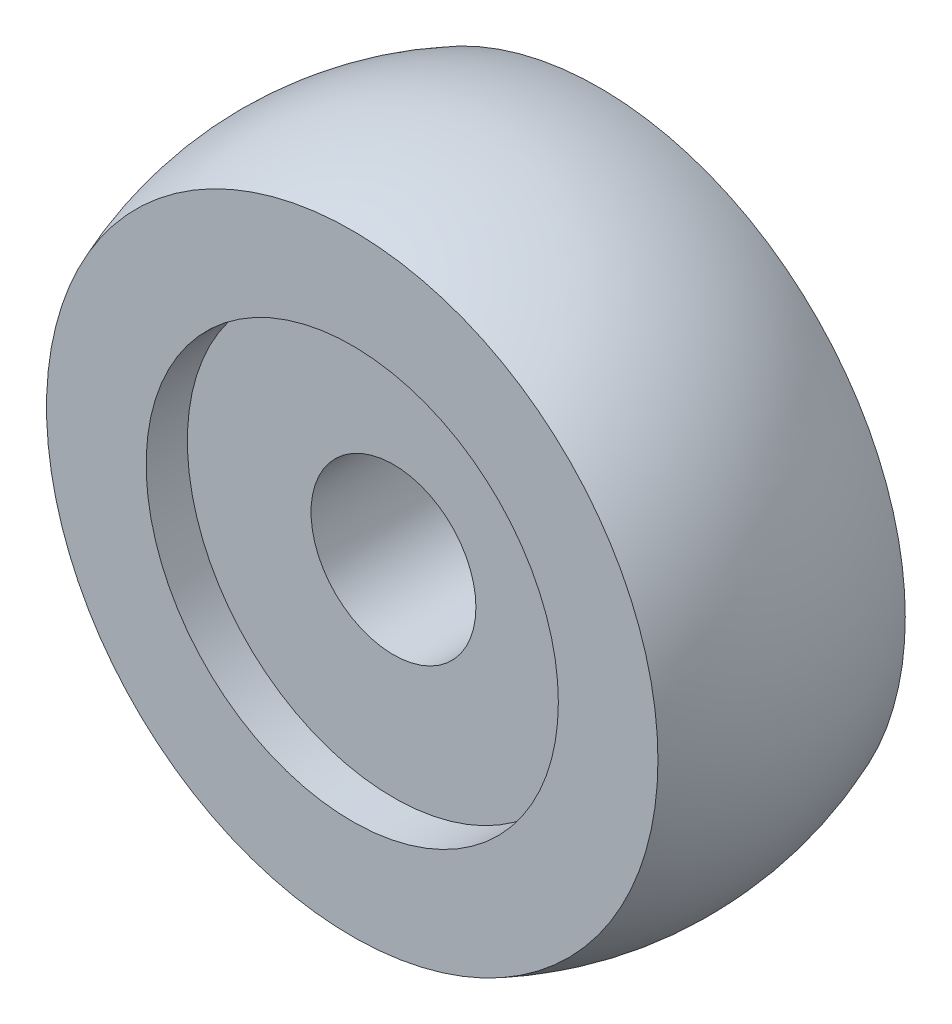
ISO-10303-21;
HEADER;
FILE_DESCRIPTION(('STEP AP214'),'2;1');
FILE_NAME('part.step','',(''),(''),'','','');
FILE_SCHEMA(('AUTOMOTIVE_DESIGN { 1 0 10303 214 1 1 1 1 }'));
ENDSEC;
DATA;
#1=APPLICATION_CONTEXT('core data for automotive mechanical design processes');
#2=APPLICATION_PROTOCOL_DEFINITION('international standard','automotive_design',2000,#1);
#3=PRODUCT_CONTEXT('',#1,'mechanical');
#4=PRODUCT('Part','Part','',(#3));
#5=PRODUCT_RELATED_PRODUCT_CATEGORY('part','',(#4));
#6=PRODUCT_DEFINITION_FORMATION('','',#4);
#7=PRODUCT_DEFINITION_CONTEXT('part definition',#1,'design');
#8=PRODUCT_DEFINITION('design','',#6,#7);
#9=PRODUCT_DEFINITION_SHAPE('','',#8);
#10=(LENGTH_UNIT() NAMED_UNIT(*) SI_UNIT(.MILLI.,.METRE.));
#11=(NAMED_UNIT(*) PLANE_ANGLE_UNIT() SI_UNIT($,.RADIAN.));
#12=(NAMED_UNIT(*) SI_UNIT($,.STERADIAN.) SOLID_ANGLE_UNIT());
#13=UNCERTAINTY_MEASURE_WITH_UNIT(LENGTH_MEASURE(1.E-05),#10,'distance_accuracy_value','');
#14=(GEOMETRIC_REPRESENTATION_CONTEXT(3) GLOBAL_UNCERTAINTY_ASSIGNED_CONTEXT((#13)) GLOBAL_UNIT_ASSIGNED_CONTEXT((#10,
#11,#12)) REPRESENTATION_CONTEXT('',''));
#15=CARTESIAN_POINT('',(0.,0.,0.));
#16=DIRECTION('',(0.,0.,1.));
#17=DIRECTION('',(1.,0.,0.));
#18=AXIS2_PLACEMENT_3D('',#15,#16,#17);
#19=CARTESIAN_POINT('',(0.,0.,0.));
#20=DIRECTION('',(0.,1.,0.));
#21=DIRECTION('',(1.,0.,0.));
#22=AXIS2_PLACEMENT_3D('',#19,#20,#21);
#23=SPHERICAL_SURFACE('',#22,8.);
#24=CARTESIAN_POINT('',(0.,0.,0.));
#25=DIRECTION('',(0.,0.,1.));
#26=DIRECTION('',(1.,0.,0.));
#27=AXIS2_PLACEMENT_3D('',#24,#25,#26);
#28=SPHERICAL_SURFACE('',#27,8.);
#29=CARTESIAN_POINT('',(0.,0.,-3.));
#30=DIRECTION('',(0.,0.,1.));
#31=DIRECTION('',(1.,0.,0.));
#32=AXIS2_PLACEMENT_3D('',#29,#30,#31);
#33=CIRCLE('',#32,7.41619848709566);
#34=CARTESIAN_POINT('',(7.41619848709566,0.,-3.));
#35=VERTEX_POINT('',#34);
#36=EDGE_CURVE('E42',#35,#35,#33,.F.);
#37=ORIENTED_EDGE('',*,*,#36,.F.);
#38=EDGE_LOOP('',(#37));
#39=FACE_BOUND('',#38,.T.);
#40=CARTESIAN_POINT('',(0.,0.,3.));
#41=DIRECTION('',(0.,0.,1.));
#42=DIRECTION('',(1.,0.,0.));
#43=AXIS2_PLACEMENT_3D('',#40,#41,#42);
#44=CIRCLE('',#43,7.41619848709566);
#45=CARTESIAN_POINT('',(7.41619848709566,0.,3.));
#46=VERTEX_POINT('',#45);
#47=EDGE_CURVE('E10',#46,#46,#44,.F.);
#48=ORIENTED_EDGE('',*,*,#47,.T.);
#49=EDGE_LOOP('',(#48));
#50=FACE_BOUND('',#49,.T.);
#51=ADVANCED_FACE('F35',(#39,#50),#28,.T.);
#52=CARTESIAN_POINT('',(0.,0.,3.));
#53=DIRECTION('',(0.,0.,1.));
#54=DIRECTION('',(1.,0.,0.));
#55=AXIS2_PLACEMENT_3D('',#52,#53,#54);
#56=PLANE('',#55);
#57=CARTESIAN_POINT('',(0.,0.,3.));
#58=DIRECTION('',(0.,0.,1.));
#59=DIRECTION('',(1.,0.,0.));
#60=AXIS2_PLACEMENT_3D('',#57,#58,#59);
#61=CIRCLE('',#60,5.);
#62=CARTESIAN_POINT('',(5.,0.,3.));
#63=VERTEX_POINT('',#62);
#64=EDGE_CURVE('E49',#63,#63,#61,.T.);
#65=ORIENTED_EDGE('',*,*,#64,.F.);
#66=EDGE_LOOP('',(#65));
#67=FACE_BOUND('',#66,.T.);
#68=ORIENTED_EDGE('',*,*,#47,.F.);
#69=EDGE_LOOP('',(#68));
#70=FACE_BOUND('',#69,.T.);
#71=ADVANCED_FACE('F86',(#67,#70),#56,.T.);
#72=CARTESIAN_POINT('',(0.,0.,-3.));
#73=DIRECTION('',(0.,0.,1.));
#74=DIRECTION('',(1.,0.,0.));
#75=AXIS2_PLACEMENT_3D('',#72,#73,#74);
#76=PLANE('',#75);
#77=CARTESIAN_POINT('',(0.,0.,-3.));
#78=DIRECTION('',(0.,0.,1.));
#79=DIRECTION('',(1.,0.,0.));
#80=AXIS2_PLACEMENT_3D('',#77,#78,#79);
#81=CIRCLE('',#80,5.);
#82=CARTESIAN_POINT('',(5.,0.,-3.));
#83=VERTEX_POINT('',#82);
#84=EDGE_CURVE('E55',#83,#83,#81,.T.);
#85=ORIENTED_EDGE('',*,*,#84,.T.);
#86=EDGE_LOOP('',(#85));
#87=FACE_BOUND('',#86,.T.);
#88=ORIENTED_EDGE('',*,*,#36,.T.);
#89=EDGE_LOOP('',(#88));
#90=FACE_BOUND('',#89,.T.);
#91=ADVANCED_FACE('F82',(#87,#90),#76,.F.);
#92=CARTESIAN_POINT('',(0.,0.,2.));
#93=DIRECTION('',(0.,0.,1.));
#94=DIRECTION('',(1.,0.,0.));
#95=AXIS2_PLACEMENT_3D('',#92,#93,#94);
#96=CYLINDRICAL_SURFACE('',#95,5.);
#97=CARTESIAN_POINT('',(0.,0.,2.));
#98=DIRECTION('',(0.,0.,1.));
#99=DIRECTION('',(1.,0.,0.));
#100=AXIS2_PLACEMENT_3D('',#97,#98,#99);
#101=CIRCLE('',#100,5.);
#102=CARTESIAN_POINT('',(5.,0.,2.));
#103=VERTEX_POINT('',#102);
#104=EDGE_CURVE('E47',#103,#103,#101,.T.);
#105=ORIENTED_EDGE('',*,*,#104,.F.);
#106=EDGE_LOOP('',(#105));
#107=FACE_BOUND('',#106,.T.);
#108=ORIENTED_EDGE('',*,*,#64,.T.);
#109=EDGE_LOOP('',(#108));
#110=FACE_BOUND('',#109,.T.);
#111=ADVANCED_FACE('F85',(#107,#110),#96,.F.);
#112=CARTESIAN_POINT('',(0.,0.,2.));
#113=DIRECTION('',(0.,0.,1.));
#114=DIRECTION('',(1.,0.,0.));
#115=AXIS2_PLACEMENT_3D('',#112,#113,#114);
#116=PLANE('',#115);
#117=CARTESIAN_POINT('',(0.,0.,2.));
#118=DIRECTION('',(0.,0.,1.));
#119=DIRECTION('',(1.,0.,0.));
#120=AXIS2_PLACEMENT_3D('',#117,#118,#119);
#121=CIRCLE('',#120,2.);
#122=CARTESIAN_POINT('',(2.,0.,2.));
#123=VERTEX_POINT('',#122);
#124=EDGE_CURVE('E60',#123,#123,#121,.T.);
#125=ORIENTED_EDGE('',*,*,#124,.F.);
#126=EDGE_LOOP('',(#125));
#127=FACE_BOUND('',#126,.T.);
#128=ORIENTED_EDGE('',*,*,#104,.T.);
#129=EDGE_LOOP('',(#128));
#130=FACE_BOUND('',#129,.T.);
#131=ADVANCED_FACE('F78',(#127,#130),#116,.T.);
#132=CARTESIAN_POINT('',(0.,0.,-2.));
#133=DIRECTION('',(0.,0.,-1.));
#134=DIRECTION('',(-1.,0.,0.));
#135=AXIS2_PLACEMENT_3D('',#132,#133,#134);
#136=CYLINDRICAL_SURFACE('',#135,5.);
#137=CARTESIAN_POINT('',(0.,0.,-2.));
#138=DIRECTION('',(0.,0.,1.));
#139=DIRECTION('',(1.,0.,0.));
#140=AXIS2_PLACEMENT_3D('',#137,#138,#139);
#141=CIRCLE('',#140,5.);
#142=CARTESIAN_POINT('',(5.,0.,-2.));
#143=VERTEX_POINT('',#142);
#144=EDGE_CURVE('E52',#143,#143,#141,.T.);
#145=ORIENTED_EDGE('',*,*,#144,.T.);
#146=EDGE_LOOP('',(#145));
#147=FACE_BOUND('',#146,.T.);
#148=ORIENTED_EDGE('',*,*,#84,.F.);
#149=EDGE_LOOP('',(#148));
#150=FACE_BOUND('',#149,.T.);
#151=ADVANCED_FACE('F72',(#147,#150),#136,.F.);
#152=CARTESIAN_POINT('',(0.,0.,-2.));
#153=DIRECTION('',(0.,0.,-1.));
#154=DIRECTION('',(1.,0.,0.));
#155=AXIS2_PLACEMENT_3D('',#152,#153,#154);
#156=PLANE('',#155);
#157=CARTESIAN_POINT('',(0.,0.,-2.));
#158=DIRECTION('',(0.,0.,-1.));
#159=DIRECTION('',(-1.,0.,0.));
#160=AXIS2_PLACEMENT_3D('',#157,#158,#159);
#161=CIRCLE('',#160,2.);
#162=CARTESIAN_POINT('',(-2.,0.,-2.));
#163=VERTEX_POINT('',#162);
#164=EDGE_CURVE('E38',#163,#163,#161,.T.);
#165=ORIENTED_EDGE('',*,*,#164,.F.);
#166=EDGE_LOOP('',(#165));
#167=FACE_BOUND('',#166,.T.);
#168=ORIENTED_EDGE('',*,*,#144,.F.);
#169=EDGE_LOOP('',(#168));
#170=FACE_BOUND('',#169,.T.);
#171=ADVANCED_FACE('F69',(#167,#170),#156,.T.);
#172=CARTESIAN_POINT('',(0.,0.,-3.));
#173=DIRECTION('',(0.,0.,1.));
#174=DIRECTION('',(1.,0.,0.));
#175=AXIS2_PLACEMENT_3D('',#172,#173,#174);
#176=CYLINDRICAL_SURFACE('',#175,2.);
#177=ORIENTED_EDGE('',*,*,#164,.T.);
#178=EDGE_LOOP('',(#177));
#179=FACE_BOUND('',#178,.T.);
#180=ORIENTED_EDGE('',*,*,#124,.T.);
#181=EDGE_LOOP('',(#180));
#182=FACE_BOUND('',#181,.T.);
#183=ADVANCED_FACE('F67',(#179,#182),#176,.F.);
#184=CLOSED_SHELL('',(#51,#71,#91,#111,#131,#151,#171,#183));
#185=MANIFOLD_SOLID_BREP('B2',#184);
#186=ADVANCED_BREP_SHAPE_REPRESENTATION('',(#18,#185),#14);
#187=SHAPE_DEFINITION_REPRESENTATION(#9,#186);
ENDSEC;
END-ISO-10303-21;
